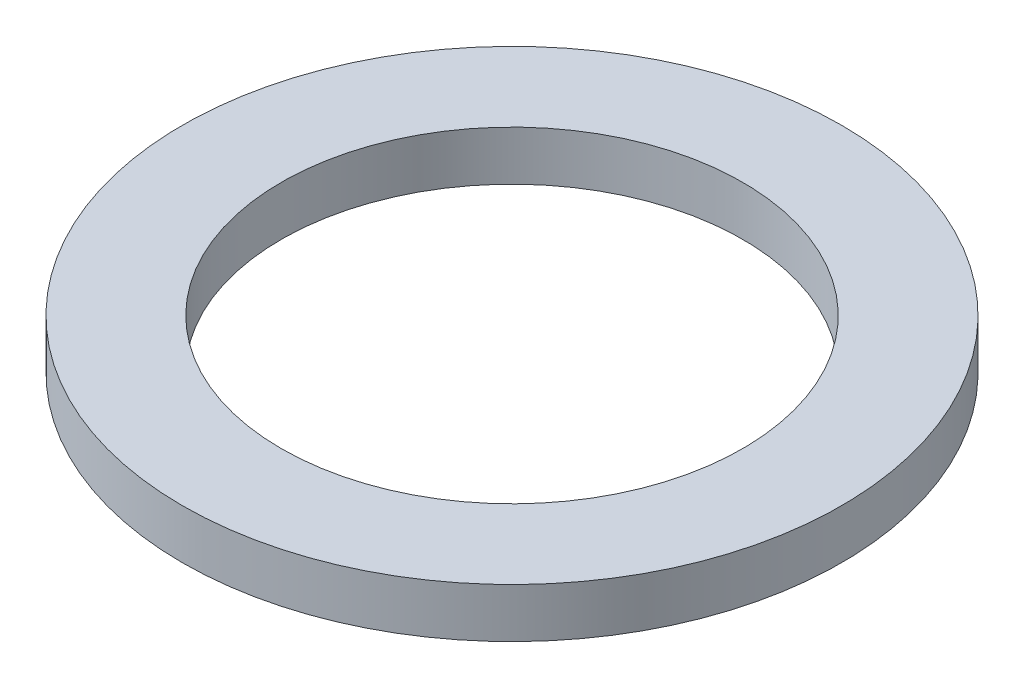
ISO-10303-21;
HEADER;
FILE_DESCRIPTION(('STEP AP214'),'2;1');
FILE_NAME('part.step','',(''),(''),'','','');
FILE_SCHEMA(('AUTOMOTIVE_DESIGN { 1 0 10303 214 1 1 1 1 }'));
ENDSEC;
DATA;
#1=APPLICATION_CONTEXT('core data for automotive mechanical design processes');
#2=APPLICATION_PROTOCOL_DEFINITION('international standard','automotive_design',2000,#1);
#3=PRODUCT_CONTEXT('',#1,'mechanical');
#4=PRODUCT('Part','Part','',(#3));
#5=PRODUCT_RELATED_PRODUCT_CATEGORY('part','',(#4));
#6=PRODUCT_DEFINITION_FORMATION('','',#4);
#7=PRODUCT_DEFINITION_CONTEXT('part definition',#1,'design');
#8=PRODUCT_DEFINITION('design','',#6,#7);
#9=PRODUCT_DEFINITION_SHAPE('','',#8);
#10=(LENGTH_UNIT() NAMED_UNIT(*) SI_UNIT(.MILLI.,.METRE.));
#11=(NAMED_UNIT(*) PLANE_ANGLE_UNIT() SI_UNIT($,.RADIAN.));
#12=(NAMED_UNIT(*) SI_UNIT($,.STERADIAN.) SOLID_ANGLE_UNIT());
#13=UNCERTAINTY_MEASURE_WITH_UNIT(LENGTH_MEASURE(1.E-05),#10,'distance_accuracy_value','');
#14=(GEOMETRIC_REPRESENTATION_CONTEXT(3) GLOBAL_UNCERTAINTY_ASSIGNED_CONTEXT((#13)) GLOBAL_UNIT_ASSIGNED_CONTEXT((#10,
#11,#12)) REPRESENTATION_CONTEXT('',''));
#15=CARTESIAN_POINT('',(0.,0.,0.));
#16=DIRECTION('',(0.,0.,1.));
#17=DIRECTION('',(1.,0.,0.));
#18=AXIS2_PLACEMENT_3D('',#15,#16,#17);
#19=CARTESIAN_POINT('',(0.,10.2160883280757,0.));
#20=DIRECTION('',(0.,1.,0.));
#21=DIRECTION('',(0.,0.,1.));
#22=AXIS2_PLACEMENT_3D('',#19,#20,#21);
#23=CYLINDRICAL_SURFACE('',#22,7.);
#24=CARTESIAN_POINT('',(0.,1.5,0.));
#25=DIRECTION('',(0.,1.,0.));
#26=DIRECTION('',(0.,0.,1.));
#27=AXIS2_PLACEMENT_3D('',#24,#25,#26);
#28=CIRCLE('',#27,7.);
#29=CARTESIAN_POINT('',(0.,1.5,7.));
#30=VERTEX_POINT('',#29);
#31=EDGE_CURVE('E38',#30,#30,#28,.T.);
#32=ORIENTED_EDGE('',*,*,#31,.T.);
#33=EDGE_LOOP('',(#32));
#34=FACE_BOUND('',#33,.T.);
#35=CARTESIAN_POINT('',(0.,0.,0.));
#36=DIRECTION('',(0.,1.,0.));
#37=DIRECTION('',(0.,0.,1.));
#38=AXIS2_PLACEMENT_3D('',#35,#36,#37);
#39=CIRCLE('',#38,7.);
#40=CARTESIAN_POINT('',(0.,0.,7.));
#41=VERTEX_POINT('',#40);
#42=EDGE_CURVE('E10',#41,#41,#39,.T.);
#43=ORIENTED_EDGE('',*,*,#42,.F.);
#44=EDGE_LOOP('',(#43));
#45=FACE_BOUND('',#44,.T.);
#46=ADVANCED_FACE('F24',(#34,#45),#23,.F.);
#47=CARTESIAN_POINT('',(7.,0.,0.));
#48=DIRECTION('',(0.,1.,0.));
#49=DIRECTION('',(0.,0.,1.));
#50=AXIS2_PLACEMENT_3D('',#47,#48,#49);
#51=PLANE('',#50);
#52=CARTESIAN_POINT('',(0.,0.,0.));
#53=DIRECTION('',(0.,1.,0.));
#54=DIRECTION('',(0.,0.,1.));
#55=AXIS2_PLACEMENT_3D('',#52,#53,#54);
#56=CIRCLE('',#55,10.);
#57=CARTESIAN_POINT('',(0.,0.,10.));
#58=VERTEX_POINT('',#57);
#59=EDGE_CURVE('E30',#58,#58,#56,.T.);
#60=ORIENTED_EDGE('',*,*,#59,.F.);
#61=EDGE_LOOP('',(#60));
#62=FACE_BOUND('',#61,.T.);
#63=ORIENTED_EDGE('',*,*,#42,.T.);
#64=EDGE_LOOP('',(#63));
#65=FACE_BOUND('',#64,.T.);
#66=ADVANCED_FACE('F54',(#62,#65),#51,.F.);
#67=CARTESIAN_POINT('',(0.,10.2160883280757,0.));
#68=DIRECTION('',(0.,1.,0.));
#69=DIRECTION('',(0.,0.,1.));
#70=AXIS2_PLACEMENT_3D('',#67,#68,#69);
#71=CYLINDRICAL_SURFACE('',#70,10.);
#72=ORIENTED_EDGE('',*,*,#59,.T.);
#73=EDGE_LOOP('',(#72));
#74=FACE_BOUND('',#73,.T.);
#75=CARTESIAN_POINT('',(0.,1.5,0.));
#76=DIRECTION('',(0.,1.,0.));
#77=DIRECTION('',(0.,0.,1.));
#78=AXIS2_PLACEMENT_3D('',#75,#76,#77);
#79=CIRCLE('',#78,10.);
#80=CARTESIAN_POINT('',(0.,1.5,10.));
#81=VERTEX_POINT('',#80);
#82=EDGE_CURVE('E34',#81,#81,#79,.T.);
#83=ORIENTED_EDGE('',*,*,#82,.F.);
#84=EDGE_LOOP('',(#83));
#85=FACE_BOUND('',#84,.T.);
#86=ADVANCED_FACE('F49',(#74,#85),#71,.T.);
#87=CARTESIAN_POINT('',(10.,1.5,0.));
#88=DIRECTION('',(0.,-1.,0.));
#89=DIRECTION('',(0.,0.,-1.));
#90=AXIS2_PLACEMENT_3D('',#87,#88,#89);
#91=PLANE('',#90);
#92=ORIENTED_EDGE('',*,*,#31,.F.);
#93=EDGE_LOOP('',(#92));
#94=FACE_BOUND('',#93,.T.);
#95=ORIENTED_EDGE('',*,*,#82,.T.);
#96=EDGE_LOOP('',(#95));
#97=FACE_BOUND('',#96,.T.);
#98=ADVANCED_FACE('F46',(#94,#97),#91,.F.);
#99=CLOSED_SHELL('',(#46,#66,#86,#98));
#100=MANIFOLD_SOLID_BREP('B2',#99);
#101=ADVANCED_BREP_SHAPE_REPRESENTATION('',(#18,#100),#14);
#102=SHAPE_DEFINITION_REPRESENTATION(#9,#101);
ENDSEC;
END-ISO-10303-21;
